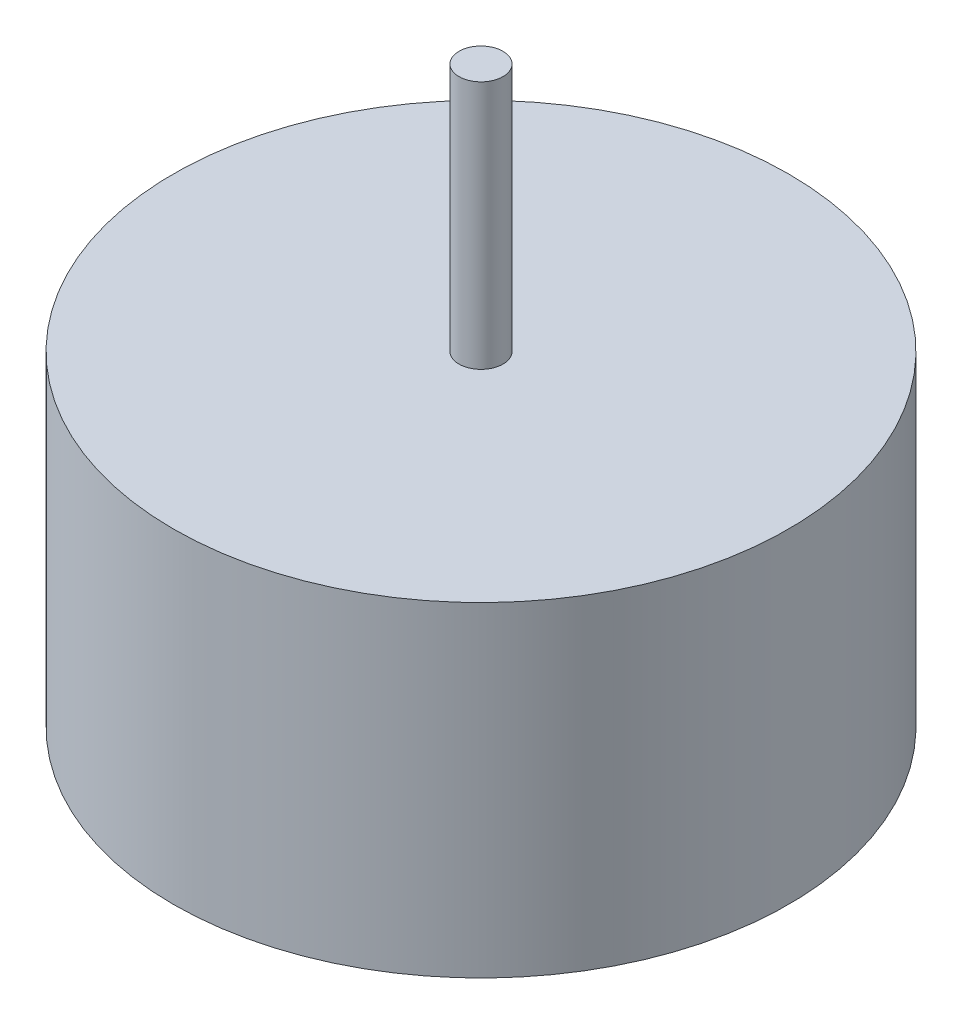
ISO-10303-21;
HEADER;
FILE_DESCRIPTION(('STEP AP214'),'2;1');
FILE_NAME('part.step','',(''),(''),'','','');
FILE_SCHEMA(('AUTOMOTIVE_DESIGN { 1 0 10303 214 1 1 1 1 }'));
ENDSEC;
DATA;
#1=APPLICATION_CONTEXT('core data for automotive mechanical design processes');
#2=APPLICATION_PROTOCOL_DEFINITION('international standard','automotive_design',2000,#1);
#3=PRODUCT_CONTEXT('',#1,'mechanical');
#4=PRODUCT('Part','Part','',(#3));
#5=PRODUCT_RELATED_PRODUCT_CATEGORY('part','',(#4));
#6=PRODUCT_DEFINITION_FORMATION('','',#4);
#7=PRODUCT_DEFINITION_CONTEXT('part definition',#1,'design');
#8=PRODUCT_DEFINITION('design','',#6,#7);
#9=PRODUCT_DEFINITION_SHAPE('','',#8);
#10=(LENGTH_UNIT() NAMED_UNIT(*) SI_UNIT(.MILLI.,.METRE.));
#11=(NAMED_UNIT(*) PLANE_ANGLE_UNIT() SI_UNIT($,.RADIAN.));
#12=(NAMED_UNIT(*) SI_UNIT($,.STERADIAN.) SOLID_ANGLE_UNIT());
#13=UNCERTAINTY_MEASURE_WITH_UNIT(LENGTH_MEASURE(1.E-05),#10,'distance_accuracy_value','');
#14=(GEOMETRIC_REPRESENTATION_CONTEXT(3) GLOBAL_UNCERTAINTY_ASSIGNED_CONTEXT((#13)) GLOBAL_UNIT_ASSIGNED_CONTEXT((#10,
#11,#12)) REPRESENTATION_CONTEXT('',''));
#15=CARTESIAN_POINT('',(0.,0.,0.));
#16=DIRECTION('',(0.,0.,1.));
#17=DIRECTION('',(1.,0.,0.));
#18=AXIS2_PLACEMENT_3D('',#15,#16,#17);
#19=CARTESIAN_POINT('',(0.,22.2,0.));
#20=DIRECTION('',(0.,-1.,0.));
#21=DIRECTION('',(0.,0.,-1.));
#22=AXIS2_PLACEMENT_3D('',#19,#20,#21);
#23=CYLINDRICAL_SURFACE('',#22,21.);
#24=CARTESIAN_POINT('',(0.,22.2,0.));
#25=DIRECTION('',(0.,1.,0.));
#26=DIRECTION('',(0.,0.,1.));
#27=AXIS2_PLACEMENT_3D('',#24,#25,#26);
#28=CIRCLE('',#27,21.);
#29=CARTESIAN_POINT('',(0.,22.2,21.));
#30=VERTEX_POINT('',#29);
#31=EDGE_CURVE('E10',#30,#30,#28,.T.);
#32=ORIENTED_EDGE('',*,*,#31,.F.);
#33=EDGE_LOOP('',(#32));
#34=FACE_BOUND('',#33,.T.);
#35=CARTESIAN_POINT('',(0.,0.,0.));
#36=DIRECTION('',(0.,1.,0.));
#37=DIRECTION('',(0.,0.,1.));
#38=AXIS2_PLACEMENT_3D('',#35,#36,#37);
#39=CIRCLE('',#38,21.);
#40=CARTESIAN_POINT('',(0.,0.,21.));
#41=VERTEX_POINT('',#40);
#42=EDGE_CURVE('E46',#41,#41,#39,.T.);
#43=ORIENTED_EDGE('',*,*,#42,.T.);
#44=EDGE_LOOP('',(#43));
#45=FACE_BOUND('',#44,.T.);
#46=ADVANCED_FACE('F43',(#34,#45),#23,.T.);
#47=CARTESIAN_POINT('',(0.,22.2,0.));
#48=DIRECTION('',(0.,1.,0.));
#49=DIRECTION('',(0.,0.,1.));
#50=AXIS2_PLACEMENT_3D('',#47,#48,#49);
#51=PLANE('',#50);
#52=CARTESIAN_POINT('',(0.,22.2,0.));
#53=DIRECTION('',(0.,1.,0.));
#54=DIRECTION('',(0.,0.,1.));
#55=AXIS2_PLACEMENT_3D('',#52,#53,#54);
#56=CIRCLE('',#55,1.5);
#57=CARTESIAN_POINT('',(0.,22.2,1.5));
#58=VERTEX_POINT('',#57);
#59=EDGE_CURVE('E54',#58,#58,#56,.F.);
#60=ORIENTED_EDGE('',*,*,#59,.T.);
#61=EDGE_LOOP('',(#60));
#62=FACE_BOUND('',#61,.T.);
#63=ORIENTED_EDGE('',*,*,#31,.T.);
#64=EDGE_LOOP('',(#63));
#65=FACE_BOUND('',#64,.T.);
#66=ADVANCED_FACE('F77',(#62,#65),#51,.T.);
#67=CARTESIAN_POINT('',(0.,0.,0.));
#68=DIRECTION('',(0.,1.,0.));
#69=DIRECTION('',(0.,0.,1.));
#70=AXIS2_PLACEMENT_3D('',#67,#68,#69);
#71=PLANE('',#70);
#72=ORIENTED_EDGE('',*,*,#42,.F.);
#73=EDGE_LOOP('',(#72));
#74=FACE_BOUND('',#73,.T.);
#75=ADVANCED_FACE('F69',(#74),#71,.F.);
#76=CARTESIAN_POINT('',(0.,39.2,0.));
#77=DIRECTION('',(0.,-1.,0.));
#78=DIRECTION('',(0.,0.,-1.));
#79=AXIS2_PLACEMENT_3D('',#76,#77,#78);
#80=CYLINDRICAL_SURFACE('',#79,1.5);
#81=ORIENTED_EDGE('',*,*,#59,.F.);
#82=EDGE_LOOP('',(#81));
#83=FACE_BOUND('',#82,.T.);
#84=CARTESIAN_POINT('',(0.,39.2,0.));
#85=DIRECTION('',(0.,1.,0.));
#86=DIRECTION('',(0.,0.,1.));
#87=AXIS2_PLACEMENT_3D('',#84,#85,#86);
#88=CIRCLE('',#87,1.5);
#89=CARTESIAN_POINT('',(0.,39.2,1.5));
#90=VERTEX_POINT('',#89);
#91=EDGE_CURVE('E58',#90,#90,#88,.T.);
#92=ORIENTED_EDGE('',*,*,#91,.F.);
#93=EDGE_LOOP('',(#92));
#94=FACE_BOUND('',#93,.T.);
#95=ADVANCED_FACE('F70',(#83,#94),#80,.T.);
#96=CARTESIAN_POINT('',(0.,39.2,0.));
#97=DIRECTION('',(0.,1.,0.));
#98=DIRECTION('',(0.,0.,1.));
#99=AXIS2_PLACEMENT_3D('',#96,#97,#98);
#100=PLANE('',#99);
#101=ORIENTED_EDGE('',*,*,#91,.T.);
#102=EDGE_LOOP('',(#101));
#103=FACE_BOUND('',#102,.T.);
#104=ADVANCED_FACE('F64',(#103),#100,.T.);
#105=CLOSED_SHELL('',(#46,#66,#75,#95,#104));
#106=MANIFOLD_SOLID_BREP('B2',#105);
#107=ADVANCED_BREP_SHAPE_REPRESENTATION('',(#18,#106),#14);
#108=SHAPE_DEFINITION_REPRESENTATION(#9,#107);
ENDSEC;
END-ISO-10303-21;
